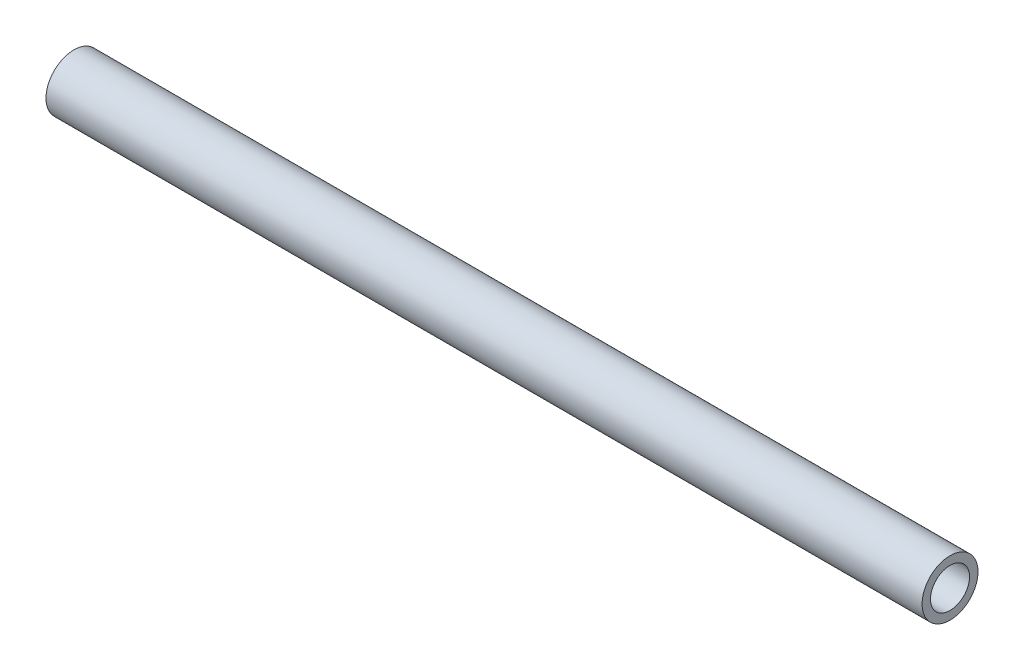
ISO-10303-21;
HEADER;
FILE_DESCRIPTION(('STEP AP214'),'2;1');
FILE_NAME('part.step','',(''),(''),'','','');
FILE_SCHEMA(('AUTOMOTIVE_DESIGN { 1 0 10303 214 1 1 1 1 }'));
ENDSEC;
DATA;
#1=APPLICATION_CONTEXT('core data for automotive mechanical design processes');
#2=APPLICATION_PROTOCOL_DEFINITION('international standard','automotive_design',2000,#1);
#3=PRODUCT_CONTEXT('',#1,'mechanical');
#4=PRODUCT('Part','Part','',(#3));
#5=PRODUCT_RELATED_PRODUCT_CATEGORY('part','',(#4));
#6=PRODUCT_DEFINITION_FORMATION('','',#4);
#7=PRODUCT_DEFINITION_CONTEXT('part definition',#1,'design');
#8=PRODUCT_DEFINITION('design','',#6,#7);
#9=PRODUCT_DEFINITION_SHAPE('','',#8);
#10=(LENGTH_UNIT() NAMED_UNIT(*) SI_UNIT(.MILLI.,.METRE.));
#11=(NAMED_UNIT(*) PLANE_ANGLE_UNIT() SI_UNIT($,.RADIAN.));
#12=(NAMED_UNIT(*) SI_UNIT($,.STERADIAN.) SOLID_ANGLE_UNIT());
#13=UNCERTAINTY_MEASURE_WITH_UNIT(LENGTH_MEASURE(1.E-05),#10,'distance_accuracy_value','');
#14=(GEOMETRIC_REPRESENTATION_CONTEXT(3) GLOBAL_UNCERTAINTY_ASSIGNED_CONTEXT((#13)) GLOBAL_UNIT_ASSIGNED_CONTEXT((#10,
#11,#12)) REPRESENTATION_CONTEXT('',''));
#15=CARTESIAN_POINT('',(0.,0.,0.));
#16=DIRECTION('',(0.,0.,1.));
#17=DIRECTION('',(1.,0.,0.));
#18=AXIS2_PLACEMENT_3D('',#15,#16,#17);
#19=CARTESIAN_POINT('',(330.2,0.,0.));
#20=DIRECTION('',(1.,0.,0.));
#21=DIRECTION('',(0.,0.,-1.));
#22=AXIS2_PLACEMENT_3D('',#19,#20,#21);
#23=PLANE('',#22);
#24=CARTESIAN_POINT('',(330.2,0.,0.));
#25=DIRECTION('',(1.,0.,0.));
#26=DIRECTION('',(0.,0.,-1.));
#27=AXIS2_PLACEMENT_3D('',#24,#25,#26);
#28=CIRCLE('',#27,10.541);
#29=CARTESIAN_POINT('',(330.2,0.,-10.541));
#30=VERTEX_POINT('',#29);
#31=EDGE_CURVE('E10',#30,#30,#28,.T.);
#32=ORIENTED_EDGE('',*,*,#31,.T.);
#33=EDGE_LOOP('',(#32));
#34=FACE_BOUND('',#33,.T.);
#35=CARTESIAN_POINT('',(330.2,0.,0.));
#36=DIRECTION('',(1.,0.,0.));
#37=DIRECTION('',(0.,0.,-1.));
#38=AXIS2_PLACEMENT_3D('',#35,#36,#37);
#39=CIRCLE('',#38,7.366);
#40=CARTESIAN_POINT('',(330.2,0.,-7.366));
#41=VERTEX_POINT('',#40);
#42=EDGE_CURVE('E42',#41,#41,#39,.T.);
#43=ORIENTED_EDGE('',*,*,#42,.F.);
#44=EDGE_LOOP('',(#43));
#45=FACE_BOUND('',#44,.T.);
#46=ADVANCED_FACE('F31',(#34,#45),#23,.T.);
#47=CARTESIAN_POINT('',(0.,0.,0.));
#48=DIRECTION('',(1.,0.,0.));
#49=DIRECTION('',(0.,0.,-1.));
#50=AXIS2_PLACEMENT_3D('',#47,#48,#49);
#51=PLANE('',#50);
#52=CARTESIAN_POINT('',(0.,0.,0.));
#53=DIRECTION('',(1.,0.,0.));
#54=DIRECTION('',(0.,0.,-1.));
#55=AXIS2_PLACEMENT_3D('',#52,#53,#54);
#56=CIRCLE('',#55,10.541);
#57=CARTESIAN_POINT('',(0.,0.,-10.541));
#58=VERTEX_POINT('',#57);
#59=EDGE_CURVE('E35',#58,#58,#56,.T.);
#60=ORIENTED_EDGE('',*,*,#59,.F.);
#61=EDGE_LOOP('',(#60));
#62=FACE_BOUND('',#61,.T.);
#63=CARTESIAN_POINT('',(0.,0.,0.));
#64=DIRECTION('',(1.,0.,0.));
#65=DIRECTION('',(0.,0.,-1.));
#66=AXIS2_PLACEMENT_3D('',#63,#64,#65);
#67=CIRCLE('',#66,7.366);
#68=CARTESIAN_POINT('',(0.,0.,-7.366));
#69=VERTEX_POINT('',#68);
#70=EDGE_CURVE('E44',#69,#69,#67,.T.);
#71=ORIENTED_EDGE('',*,*,#70,.T.);
#72=EDGE_LOOP('',(#71));
#73=FACE_BOUND('',#72,.T.);
#74=ADVANCED_FACE('F54',(#62,#73),#51,.F.);
#75=CARTESIAN_POINT('',(330.2,0.,0.));
#76=DIRECTION('',(-1.,0.,0.));
#77=DIRECTION('',(0.,0.,1.));
#78=AXIS2_PLACEMENT_3D('',#75,#76,#77);
#79=CYLINDRICAL_SURFACE('',#78,10.541);
#80=ORIENTED_EDGE('',*,*,#31,.F.);
#81=EDGE_LOOP('',(#80));
#82=FACE_BOUND('',#81,.T.);
#83=ORIENTED_EDGE('',*,*,#59,.T.);
#84=EDGE_LOOP('',(#83));
#85=FACE_BOUND('',#84,.T.);
#86=ADVANCED_FACE('F33',(#82,#85),#79,.T.);
#87=CARTESIAN_POINT('',(330.2,0.,0.));
#88=DIRECTION('',(-1.,0.,0.));
#89=DIRECTION('',(0.,0.,1.));
#90=AXIS2_PLACEMENT_3D('',#87,#88,#89);
#91=CYLINDRICAL_SURFACE('',#90,7.366);
#92=ORIENTED_EDGE('',*,*,#42,.T.);
#93=EDGE_LOOP('',(#92));
#94=FACE_BOUND('',#93,.T.);
#95=ORIENTED_EDGE('',*,*,#70,.F.);
#96=EDGE_LOOP('',(#95));
#97=FACE_BOUND('',#96,.T.);
#98=ADVANCED_FACE('F50',(#94,#97),#91,.F.);
#99=CLOSED_SHELL('',(#46,#74,#86,#98));
#100=MANIFOLD_SOLID_BREP('B2',#99);
#101=ADVANCED_BREP_SHAPE_REPRESENTATION('',(#18,#100),#14);
#102=SHAPE_DEFINITION_REPRESENTATION(#9,#101);
ENDSEC;
END-ISO-10303-21;
